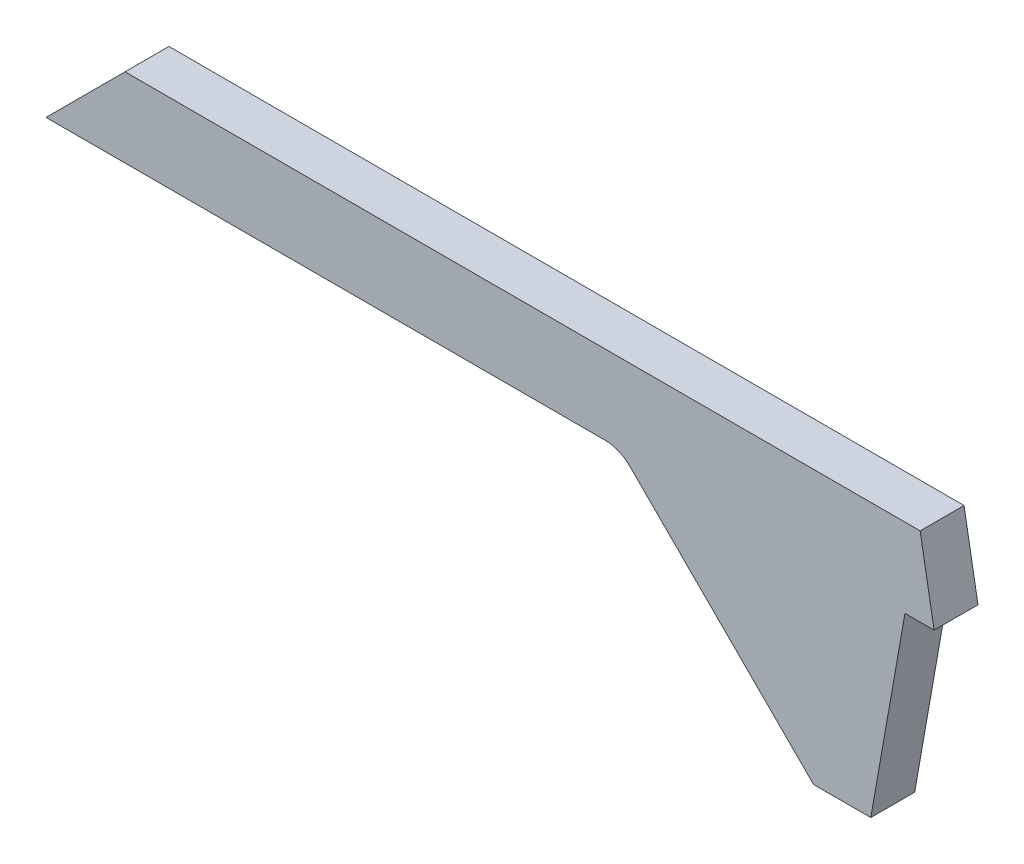
ISO-10303-21;
HEADER;
FILE_DESCRIPTION(('STEP AP214'),'2;1');
FILE_NAME('part.step','',(''),(''),'','','');
FILE_SCHEMA(('AUTOMOTIVE_DESIGN { 1 0 10303 214 1 1 1 1 }'));
ENDSEC;
DATA;
#1=APPLICATION_CONTEXT('core data for automotive mechanical design processes');
#2=APPLICATION_PROTOCOL_DEFINITION('international standard','automotive_design',2000,#1);
#3=PRODUCT_CONTEXT('',#1,'mechanical');
#4=PRODUCT('Part','Part','',(#3));
#5=PRODUCT_RELATED_PRODUCT_CATEGORY('part','',(#4));
#6=PRODUCT_DEFINITION_FORMATION('','',#4);
#7=PRODUCT_DEFINITION_CONTEXT('part definition',#1,'design');
#8=PRODUCT_DEFINITION('design','',#6,#7);
#9=PRODUCT_DEFINITION_SHAPE('','',#8);
#10=(LENGTH_UNIT() NAMED_UNIT(*) SI_UNIT(.MILLI.,.METRE.));
#11=(NAMED_UNIT(*) PLANE_ANGLE_UNIT() SI_UNIT($,.RADIAN.));
#12=(NAMED_UNIT(*) SI_UNIT($,.STERADIAN.) SOLID_ANGLE_UNIT());
#13=UNCERTAINTY_MEASURE_WITH_UNIT(LENGTH_MEASURE(1.E-05),#10,'distance_accuracy_value','');
#14=(GEOMETRIC_REPRESENTATION_CONTEXT(3) GLOBAL_UNCERTAINTY_ASSIGNED_CONTEXT((#13)) GLOBAL_UNIT_ASSIGNED_CONTEXT((#10,
#11,#12)) REPRESENTATION_CONTEXT('',''));
#15=CARTESIAN_POINT('',(0.,0.,0.));
#16=DIRECTION('',(0.,0.,1.));
#17=DIRECTION('',(1.,0.,0.));
#18=AXIS2_PLACEMENT_3D('',#15,#16,#17);
#19=CARTESIAN_POINT('',(791.618686936829,-206.248,96.175));
#20=DIRECTION('',(-0.984807753012207,0.173648177666938,0.));
#21=DIRECTION('',(-0.173648177666938,-0.984807753012207,0.));
#22=AXIS2_PLACEMENT_3D('',#19,#20,#21);
#23=PLANE('',#22);
#24=DIRECTION('',(0.173648177666938,0.984807753012207,0.));
#25=VECTOR('',#24,1.);
#26=CARTESIAN_POINT('',(791.618686936829,-206.248,89.825));
#27=LINE('',#26,#25);
#28=CARTESIAN_POINT('',(786.672833799206,-234.297326981899,89.825));
#29=VERTEX_POINT('',#28);
#30=CARTESIAN_POINT('',(791.618686936829,-206.248,89.825));
#31=VERTEX_POINT('',#30);
#32=EDGE_CURVE('E134',#29,#31,#27,.T.);
#33=ORIENTED_EDGE('',*,*,#32,.T.);
#34=DIRECTION('',(0.,0.,-1.));
#35=VECTOR('',#34,1.);
#36=CARTESIAN_POINT('',(791.618686936829,-206.248,96.175));
#37=LINE('',#36,#35);
#38=CARTESIAN_POINT('',(791.618686936829,-206.248,96.175));
#39=VERTEX_POINT('',#38);
#40=EDGE_CURVE('E11',#39,#31,#37,.T.);
#41=ORIENTED_EDGE('',*,*,#40,.F.);
#42=DIRECTION('',(0.173648177666938,0.984807753012207,0.));
#43=VECTOR('',#42,1.);
#44=CARTESIAN_POINT('',(791.618686936829,-206.248,96.175));
#45=LINE('',#44,#43);
#46=CARTESIAN_POINT('',(786.672833799206,-234.297326981899,96.175));
#47=VERTEX_POINT('',#46);
#48=EDGE_CURVE('E150',#47,#39,#45,.T.);
#49=ORIENTED_EDGE('',*,*,#48,.F.);
#50=DIRECTION('',(0.,0.,-1.));
#51=VECTOR('',#50,1.);
#52=CARTESIAN_POINT('',(786.672833799206,-234.297326981899,96.175));
#53=LINE('',#52,#51);
#54=EDGE_CURVE('E130',#47,#29,#53,.T.);
#55=ORIENTED_EDGE('',*,*,#54,.T.);
#56=EDGE_LOOP('',(#33,#41,#49,#55));
#57=FACE_BOUND('',#56,.T.);
#58=ADVANCED_FACE('F32',(#57),#23,.F.);
#59=CARTESIAN_POINT('',(795.830241144582,-206.248,96.175));
#60=DIRECTION('',(0.,1.,0.));
#61=DIRECTION('',(0.,0.,1.));
#62=AXIS2_PLACEMENT_3D('',#59,#60,#61);
#63=PLANE('',#62);
#64=DIRECTION('',(1.,0.,0.));
#65=VECTOR('',#64,1.);
#66=CARTESIAN_POINT('',(795.830241144582,-206.248,89.825));
#67=LINE('',#66,#65);
#68=CARTESIAN_POINT('',(795.830241144582,-206.248,89.825));
#69=VERTEX_POINT('',#68);
#70=EDGE_CURVE('E137',#31,#69,#67,.T.);
#71=ORIENTED_EDGE('',*,*,#70,.T.);
#72=DIRECTION('',(0.,0.,-1.));
#73=VECTOR('',#72,1.);
#74=CARTESIAN_POINT('',(795.830241144582,-206.248,96.175));
#75=LINE('',#74,#73);
#76=CARTESIAN_POINT('',(795.830241144582,-206.248,96.175));
#77=VERTEX_POINT('',#76);
#78=EDGE_CURVE('E40',#77,#69,#75,.T.);
#79=ORIENTED_EDGE('',*,*,#78,.F.);
#80=DIRECTION('',(1.,0.,0.));
#81=VECTOR('',#80,1.);
#82=CARTESIAN_POINT('',(795.830241144582,-206.248,96.175));
#83=LINE('',#82,#81);
#84=EDGE_CURVE('E94',#39,#77,#83,.T.);
#85=ORIENTED_EDGE('',*,*,#84,.F.);
#86=ORIENTED_EDGE('',*,*,#40,.T.);
#87=EDGE_LOOP('',(#71,#79,#85,#86));
#88=FACE_BOUND('',#87,.T.);
#89=ADVANCED_FACE('F193',(#88),#63,.F.);
#90=CARTESIAN_POINT('',(793.814823755084,-194.818,96.175));
#91=DIRECTION('',(-0.984807753012208,-0.173648177666928,0.));
#92=DIRECTION('',(0.173648177666928,-0.984807753012208,0.));
#93=AXIS2_PLACEMENT_3D('',#90,#91,#92);
#94=PLANE('',#93);
#95=DIRECTION('',(-0.173648177666928,0.984807753012208,0.));
#96=VECTOR('',#95,1.);
#97=CARTESIAN_POINT('',(793.814823755084,-194.818,89.825));
#98=LINE('',#97,#96);
#99=CARTESIAN_POINT('',(793.814823755084,-194.818,89.825));
#100=VERTEX_POINT('',#99);
#101=EDGE_CURVE('E139',#69,#100,#98,.T.);
#102=ORIENTED_EDGE('',*,*,#101,.T.);
#103=DIRECTION('',(0.,0.,-1.));
#104=VECTOR('',#103,1.);
#105=CARTESIAN_POINT('',(793.814823755084,-194.818,96.175));
#106=LINE('',#105,#104);
#107=CARTESIAN_POINT('',(793.814823755084,-194.818,96.175));
#108=VERTEX_POINT('',#107);
#109=EDGE_CURVE('E160',#108,#100,#106,.T.);
#110=ORIENTED_EDGE('',*,*,#109,.F.);
#111=DIRECTION('',(-0.173648177666928,0.984807753012208,0.));
#112=VECTOR('',#111,1.);
#113=CARTESIAN_POINT('',(793.814823755084,-194.818,96.175));
#114=LINE('',#113,#112);
#115=EDGE_CURVE('E168',#77,#108,#114,.T.);
#116=ORIENTED_EDGE('',*,*,#115,.F.);
#117=ORIENTED_EDGE('',*,*,#78,.T.);
#118=EDGE_LOOP('',(#102,#110,#116,#117));
#119=FACE_BOUND('',#118,.T.);
#120=ADVANCED_FACE('F166',(#119),#94,.F.);
#121=CARTESIAN_POINT('',(678.811261469056,-194.818,96.175));
#122=DIRECTION('',(0.,-1.,0.));
#123=DIRECTION('',(1.,0.,0.));
#124=AXIS2_PLACEMENT_3D('',#121,#122,#123);
#125=PLANE('',#124);
#126=DIRECTION('',(-1.,0.,0.));
#127=VECTOR('',#126,1.);
#128=CARTESIAN_POINT('',(678.811261469056,-194.818,89.825));
#129=LINE('',#128,#127);
#130=CARTESIAN_POINT('',(678.811261469056,-194.818,89.825));
#131=VERTEX_POINT('',#130);
#132=EDGE_CURVE('E141',#100,#131,#129,.T.);
#133=ORIENTED_EDGE('',*,*,#132,.T.);
#134=DIRECTION('',(0.,0.,-1.));
#135=VECTOR('',#134,1.);
#136=CARTESIAN_POINT('',(678.811261469056,-194.818,96.175));
#137=LINE('',#136,#135);
#138=CARTESIAN_POINT('',(678.811261469056,-194.818,96.175));
#139=VERTEX_POINT('',#138);
#140=EDGE_CURVE('E157',#139,#131,#137,.T.);
#141=ORIENTED_EDGE('',*,*,#140,.F.);
#142=DIRECTION('',(-1.,0.,0.));
#143=VECTOR('',#142,1.);
#144=CARTESIAN_POINT('',(678.811261469056,-194.818,96.175));
#145=LINE('',#144,#143);
#146=EDGE_CURVE('E184',#108,#139,#145,.T.);
#147=ORIENTED_EDGE('',*,*,#146,.F.);
#148=ORIENTED_EDGE('',*,*,#109,.T.);
#149=EDGE_LOOP('',(#133,#141,#147,#148));
#150=FACE_BOUND('',#149,.T.);
#151=ADVANCED_FACE('F177',(#150),#125,.F.);
#152=CARTESIAN_POINT('',(678.811261469056,-194.818,96.175));
#153=DIRECTION('',(0.707106781186546,-0.707106781186549,0.));
#154=DIRECTION('',(0.707106781186549,0.707106781186546,0.));
#155=AXIS2_PLACEMENT_3D('',#152,#153,#154);
#156=PLANE('',#155);
#157=DIRECTION('',(-0.707106781186549,-0.707106781186546,0.));
#158=VECTOR('',#157,1.);
#159=CARTESIAN_POINT('',(678.811261469056,-194.818,89.825));
#160=LINE('',#159,#158);
#161=CARTESIAN_POINT('',(667.381261469056,-206.248,89.825));
#162=VERTEX_POINT('',#161);
#163=EDGE_CURVE('E143',#131,#162,#160,.T.);
#164=ORIENTED_EDGE('',*,*,#163,.T.);
#165=DIRECTION('',(0.,0.,-1.));
#166=VECTOR('',#165,1.);
#167=CARTESIAN_POINT('',(667.381261469056,-206.248,96.175));
#168=LINE('',#167,#166);
#169=CARTESIAN_POINT('',(667.381261469056,-206.248,96.175));
#170=VERTEX_POINT('',#169);
#171=EDGE_CURVE('E154',#170,#162,#168,.T.);
#172=ORIENTED_EDGE('',*,*,#171,.F.);
#173=DIRECTION('',(-0.707106781186549,-0.707106781186546,0.));
#174=VECTOR('',#173,1.);
#175=CARTESIAN_POINT('',(678.811261469056,-194.818,96.175));
#176=LINE('',#175,#174);
#177=EDGE_CURVE('E183',#139,#170,#176,.T.);
#178=ORIENTED_EDGE('',*,*,#177,.F.);
#179=ORIENTED_EDGE('',*,*,#140,.T.);
#180=EDGE_LOOP('',(#164,#172,#178,#179));
#181=FACE_BOUND('',#180,.T.);
#182=ADVANCED_FACE('F181',(#181),#156,.F.);
#183=CARTESIAN_POINT('',(748.247897551582,-206.248,96.175));
#184=DIRECTION('',(0.,1.,0.));
#185=DIRECTION('',(-1.,0.,0.));
#186=AXIS2_PLACEMENT_3D('',#183,#184,#185);
#187=PLANE('',#186);
#188=DIRECTION('',(1.,0.,0.));
#189=VECTOR('',#188,1.);
#190=CARTESIAN_POINT('',(748.247897551582,-206.248,89.825));
#191=LINE('',#190,#189);
#192=CARTESIAN_POINT('',(748.247897551582,-206.247999999997,89.825));
#193=VERTEX_POINT('',#192);
#194=EDGE_CURVE('E145',#162,#193,#191,.T.);
#195=ORIENTED_EDGE('',*,*,#194,.T.);
#196=DIRECTION('',(0.,0.,-1.));
#197=VECTOR('',#196,1.);
#198=CARTESIAN_POINT('',(748.247897551582,-206.247999999997,96.175));
#199=LINE('',#198,#197);
#200=CARTESIAN_POINT('',(748.247897551582,-206.247999999997,96.175));
#201=VERTEX_POINT('',#200);
#202=EDGE_CURVE('E125',#201,#193,#199,.T.);
#203=ORIENTED_EDGE('',*,*,#202,.F.);
#204=DIRECTION('',(1.,0.,0.));
#205=VECTOR('',#204,1.);
#206=CARTESIAN_POINT('',(748.247897551582,-206.248,96.175));
#207=LINE('',#206,#205);
#208=EDGE_CURVE('E116',#170,#201,#207,.T.);
#209=ORIENTED_EDGE('',*,*,#208,.F.);
#210=ORIENTED_EDGE('',*,*,#171,.T.);
#211=EDGE_LOOP('',(#195,#203,#209,#210));
#212=FACE_BOUND('',#211,.T.);
#213=ADVANCED_FACE('F205',(#212),#187,.F.);
#214=CARTESIAN_POINT('',(748.247897551582,-211.328,96.175));
#215=DIRECTION('',(0.,0.,-1.));
#216=DIRECTION('',(-1.,0.,0.));
#217=AXIS2_PLACEMENT_3D('',#214,#215,#216);
#218=CYLINDRICAL_SURFACE('',#217,5.0800000000033);
#219=CARTESIAN_POINT('',(748.247897551582,-211.328,89.825));
#220=DIRECTION('',(0.,0.,-1.));
#221=DIRECTION('',(1.,0.,0.));
#222=AXIS2_PLACEMENT_3D('',#219,#220,#221);
#223=CIRCLE('',#222,5.0800000000033);
#224=CARTESIAN_POINT('',(751.840000000019,-207.735897551573,89.825));
#225=VERTEX_POINT('',#224);
#226=EDGE_CURVE('E124',#193,#225,#223,.T.);
#227=ORIENTED_EDGE('',*,*,#226,.T.);
#228=DIRECTION('',(0.,0.,-1.));
#229=VECTOR('',#228,1.);
#230=CARTESIAN_POINT('',(751.840000000019,-207.735897551573,96.175));
#231=LINE('',#230,#229);
#232=CARTESIAN_POINT('',(751.840000000019,-207.735897551573,96.175));
#233=VERTEX_POINT('',#232);
#234=EDGE_CURVE('E121',#233,#225,#231,.T.);
#235=ORIENTED_EDGE('',*,*,#234,.F.);
#236=CARTESIAN_POINT('',(748.247897551582,-211.328,96.175));
#237=DIRECTION('',(0.,0.,-1.));
#238=DIRECTION('',(1.,0.,0.));
#239=AXIS2_PLACEMENT_3D('',#236,#237,#238);
#240=CIRCLE('',#239,5.0800000000033);
#241=EDGE_CURVE('E110',#201,#233,#240,.T.);
#242=ORIENTED_EDGE('',*,*,#241,.F.);
#243=ORIENTED_EDGE('',*,*,#202,.T.);
#244=EDGE_LOOP('',(#227,#235,#242,#243));
#245=FACE_BOUND('',#244,.T.);
#246=ADVANCED_FACE('F122',(#245),#218,.F.);
#247=CARTESIAN_POINT('',(751.840000000019,-207.735897551573,96.175));
#248=DIRECTION('',(0.70710678118654,0.707106781186555,0.));
#249=DIRECTION('',(-0.707106781186555,0.70710678118654,0.));
#250=AXIS2_PLACEMENT_3D('',#247,#248,#249);
#251=PLANE('',#250);
#252=DIRECTION('',(0.707106781186555,-0.70710678118654,0.));
#253=VECTOR('',#252,1.);
#254=CARTESIAN_POINT('',(751.840000000019,-207.735897551573,89.825));
#255=LINE('',#254,#253);
#256=CARTESIAN_POINT('',(778.401429430344,-234.297326981898,89.825));
#257=VERTEX_POINT('',#256);
#258=EDGE_CURVE('E80',#225,#257,#255,.T.);
#259=ORIENTED_EDGE('',*,*,#258,.T.);
#260=DIRECTION('',(0.,0.,-1.));
#261=VECTOR('',#260,1.);
#262=CARTESIAN_POINT('',(778.401429430344,-234.297326981898,96.175));
#263=LINE('',#262,#261);
#264=CARTESIAN_POINT('',(778.401429430344,-234.297326981898,96.175));
#265=VERTEX_POINT('',#264);
#266=EDGE_CURVE('E126',#265,#257,#263,.T.);
#267=ORIENTED_EDGE('',*,*,#266,.F.);
#268=DIRECTION('',(0.707106781186555,-0.70710678118654,0.));
#269=VECTOR('',#268,1.);
#270=CARTESIAN_POINT('',(751.840000000019,-207.735897551573,96.175));
#271=LINE('',#270,#269);
#272=EDGE_CURVE('E114',#233,#265,#271,.T.);
#273=ORIENTED_EDGE('',*,*,#272,.F.);
#274=ORIENTED_EDGE('',*,*,#234,.T.);
#275=EDGE_LOOP('',(#259,#267,#273,#274));
#276=FACE_BOUND('',#275,.T.);
#277=ADVANCED_FACE('F128',(#276),#251,.F.);
#278=CARTESIAN_POINT('',(786.672833799206,-234.297326981899,96.175));
#279=DIRECTION('',(1.1744621629238E-13,1.,0.));
#280=DIRECTION('',(-1.,1.1744621629238E-13,0.));
#281=AXIS2_PLACEMENT_3D('',#278,#279,#280);
#282=PLANE('',#281);
#283=DIRECTION('',(1.,-1.1744621629238E-13,0.));
#284=VECTOR('',#283,1.);
#285=CARTESIAN_POINT('',(786.672833799206,-234.297326981899,89.825));
#286=LINE('',#285,#284);
#287=EDGE_CURVE('E86',#257,#29,#286,.T.);
#288=ORIENTED_EDGE('',*,*,#287,.T.);
#289=ORIENTED_EDGE('',*,*,#54,.F.);
#290=DIRECTION('',(1.,-1.1744621629238E-13,0.));
#291=VECTOR('',#290,1.);
#292=CARTESIAN_POINT('',(786.672833799206,-234.297326981899,96.175));
#293=LINE('',#292,#291);
#294=EDGE_CURVE('E48',#265,#47,#293,.T.);
#295=ORIENTED_EDGE('',*,*,#294,.F.);
#296=ORIENTED_EDGE('',*,*,#266,.T.);
#297=EDGE_LOOP('',(#288,#289,#295,#296));
#298=FACE_BOUND('',#297,.T.);
#299=ADVANCED_FACE('F213',(#298),#282,.F.);
#300=CARTESIAN_POINT('',(748.247897551582,-211.328,96.175));
#301=DIRECTION('',(0.,0.,1.));
#302=DIRECTION('',(1.,0.,0.));
#303=AXIS2_PLACEMENT_3D('',#300,#301,#302);
#304=PLANE('',#303);
#305=ORIENTED_EDGE('',*,*,#48,.T.);
#306=ORIENTED_EDGE('',*,*,#84,.T.);
#307=ORIENTED_EDGE('',*,*,#115,.T.);
#308=ORIENTED_EDGE('',*,*,#146,.T.);
#309=ORIENTED_EDGE('',*,*,#177,.T.);
#310=ORIENTED_EDGE('',*,*,#208,.T.);
#311=ORIENTED_EDGE('',*,*,#241,.T.);
#312=ORIENTED_EDGE('',*,*,#272,.T.);
#313=ORIENTED_EDGE('',*,*,#294,.T.);
#314=EDGE_LOOP('',(#305,#306,#307,#308,#309,#310,#311,#312,#313));
#315=FACE_BOUND('',#314,.T.);
#316=ADVANCED_FACE('F112',(#315),#304,.T.);
#317=CARTESIAN_POINT('',(748.247897551582,-211.328,89.825));
#318=DIRECTION('',(0.,0.,1.));
#319=DIRECTION('',(1.,0.,0.));
#320=AXIS2_PLACEMENT_3D('',#317,#318,#319);
#321=PLANE('',#320);
#322=ORIENTED_EDGE('',*,*,#32,.F.);
#323=ORIENTED_EDGE('',*,*,#287,.F.);
#324=ORIENTED_EDGE('',*,*,#258,.F.);
#325=ORIENTED_EDGE('',*,*,#226,.F.);
#326=ORIENTED_EDGE('',*,*,#194,.F.);
#327=ORIENTED_EDGE('',*,*,#163,.F.);
#328=ORIENTED_EDGE('',*,*,#132,.F.);
#329=ORIENTED_EDGE('',*,*,#101,.F.);
#330=ORIENTED_EDGE('',*,*,#70,.F.);
#331=EDGE_LOOP('',(#322,#323,#324,#325,#326,#327,#328,#329,#330));
#332=FACE_BOUND('',#331,.T.);
#333=ADVANCED_FACE('F172',(#332),#321,.F.);
#334=CLOSED_SHELL('',(#58,#89,#120,#151,#182,#213,#246,#277,#299,#316,#333));
#335=MANIFOLD_SOLID_BREP('B2',#334);
#336=ADVANCED_BREP_SHAPE_REPRESENTATION('',(#18,#335),#14);
#337=SHAPE_DEFINITION_REPRESENTATION(#9,#336);
ENDSEC;
END-ISO-10303-21;
